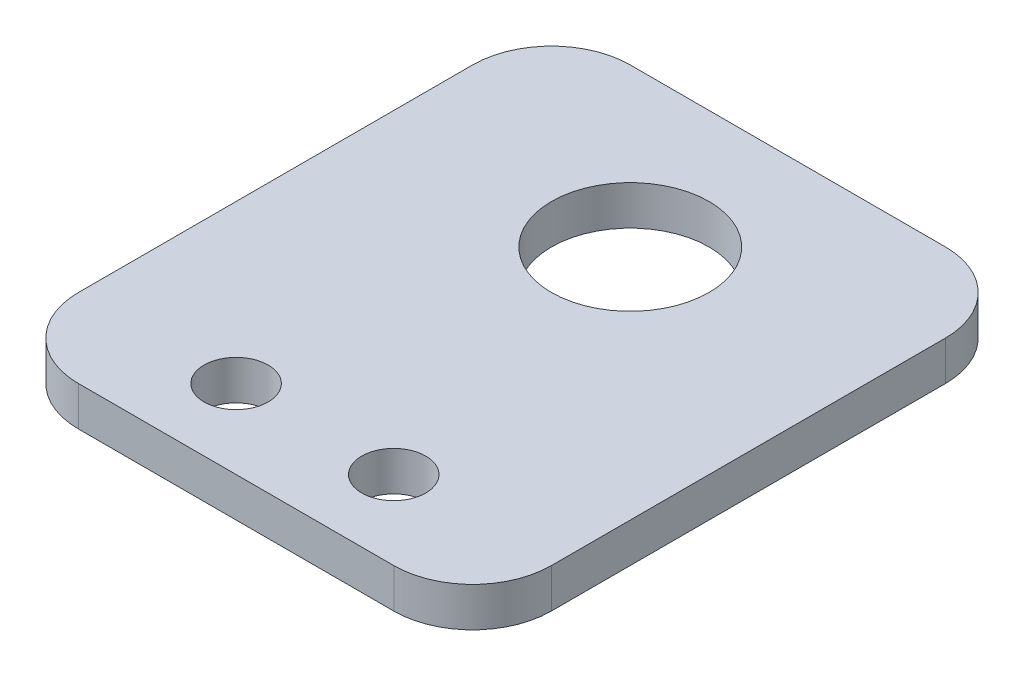
ISO-10303-21;
HEADER;
FILE_DESCRIPTION(('STEP AP214'),'2;1');
FILE_NAME('part.step','',(''),(''),'','','');
FILE_SCHEMA(('AUTOMOTIVE_DESIGN { 1 0 10303 214 1 1 1 1 }'));
ENDSEC;
DATA;
#1=APPLICATION_CONTEXT('core data for automotive mechanical design processes');
#2=APPLICATION_PROTOCOL_DEFINITION('international standard','automotive_design',2000,#1);
#3=PRODUCT_CONTEXT('',#1,'mechanical');
#4=PRODUCT('Part','Part','',(#3));
#5=PRODUCT_RELATED_PRODUCT_CATEGORY('part','',(#4));
#6=PRODUCT_DEFINITION_FORMATION('','',#4);
#7=PRODUCT_DEFINITION_CONTEXT('part definition',#1,'design');
#8=PRODUCT_DEFINITION('design','',#6,#7);
#9=PRODUCT_DEFINITION_SHAPE('','',#8);
#10=(LENGTH_UNIT() NAMED_UNIT(*) SI_UNIT(.MILLI.,.METRE.));
#11=(NAMED_UNIT(*) PLANE_ANGLE_UNIT() SI_UNIT($,.RADIAN.));
#12=(NAMED_UNIT(*) SI_UNIT($,.STERADIAN.) SOLID_ANGLE_UNIT());
#13=UNCERTAINTY_MEASURE_WITH_UNIT(LENGTH_MEASURE(1.E-05),#10,'distance_accuracy_value','');
#14=(GEOMETRIC_REPRESENTATION_CONTEXT(3) GLOBAL_UNCERTAINTY_ASSIGNED_CONTEXT((#13)) GLOBAL_UNIT_ASSIGNED_CONTEXT((#10,
#11,#12)) REPRESENTATION_CONTEXT('',''));
#15=CARTESIAN_POINT('',(0.,0.,0.));
#16=DIRECTION('',(0.,0.,1.));
#17=DIRECTION('',(1.,0.,0.));
#18=AXIS2_PLACEMENT_3D('',#15,#16,#17);
#19=CARTESIAN_POINT('',(25.4,6.35,31.75));
#20=DIRECTION('',(0.,-1.,0.));
#21=DIRECTION('',(0.,0.,-1.));
#22=AXIS2_PLACEMENT_3D('',#19,#20,#21);
#23=CYLINDRICAL_SURFACE('',#22,12.7);
#24=CARTESIAN_POINT('',(25.4,0.,31.75));
#25=DIRECTION('',(0.,1.,0.));
#26=DIRECTION('',(0.,0.,1.));
#27=AXIS2_PLACEMENT_3D('',#24,#25,#26);
#28=CIRCLE('',#27,12.7);
#29=CARTESIAN_POINT('',(25.3999999999999,0.,44.45));
#30=VERTEX_POINT('',#29);
#31=CARTESIAN_POINT('',(38.1,0.,31.7499999999999));
#32=VERTEX_POINT('',#31);
#33=EDGE_CURVE('E165',#30,#32,#28,.T.);
#34=ORIENTED_EDGE('',*,*,#33,.T.);
#35=DIRECTION('',(0.,-1.,0.));
#36=VECTOR('',#35,1.);
#37=CARTESIAN_POINT('',(38.1,6.35,31.7499999999999));
#38=LINE('',#37,#36);
#39=CARTESIAN_POINT('',(38.1,6.35,31.7499999999999));
#40=VERTEX_POINT('',#39);
#41=EDGE_CURVE('E11',#40,#32,#38,.T.);
#42=ORIENTED_EDGE('',*,*,#41,.F.);
#43=CARTESIAN_POINT('',(25.4,6.35,31.75));
#44=DIRECTION('',(0.,1.,0.));
#45=DIRECTION('',(0.,0.,1.));
#46=AXIS2_PLACEMENT_3D('',#43,#44,#45);
#47=CIRCLE('',#46,12.7);
#48=CARTESIAN_POINT('',(25.3999999999999,6.35,44.45));
#49=VERTEX_POINT('',#48);
#50=EDGE_CURVE('E188',#49,#40,#47,.T.);
#51=ORIENTED_EDGE('',*,*,#50,.F.);
#52=DIRECTION('',(0.,-1.,0.));
#53=VECTOR('',#52,1.);
#54=CARTESIAN_POINT('',(25.3999999999999,6.35,44.45));
#55=LINE('',#54,#53);
#56=EDGE_CURVE('E161',#49,#30,#55,.T.);
#57=ORIENTED_EDGE('',*,*,#56,.T.);
#58=EDGE_LOOP('',(#34,#42,#51,#57));
#59=FACE_BOUND('',#58,.T.);
#60=ADVANCED_FACE('F47',(#59),#23,.T.);
#61=CARTESIAN_POINT('',(38.1,6.35,-31.7499999999999));
#62=DIRECTION('',(-1.,0.,0.));
#63=DIRECTION('',(0.,0.,1.));
#64=AXIS2_PLACEMENT_3D('',#61,#62,#63);
#65=PLANE('',#64);
#66=DIRECTION('',(0.,0.,-1.));
#67=VECTOR('',#66,1.);
#68=CARTESIAN_POINT('',(38.1,0.,-31.7499999999999));
#69=LINE('',#68,#67);
#70=CARTESIAN_POINT('',(38.1,0.,-31.7499999999999));
#71=VERTEX_POINT('',#70);
#72=EDGE_CURVE('E169',#32,#71,#69,.T.);
#73=ORIENTED_EDGE('',*,*,#72,.T.);
#74=DIRECTION('',(0.,-1.,0.));
#75=VECTOR('',#74,1.);
#76=CARTESIAN_POINT('',(38.1,6.35,-31.7499999999999));
#77=LINE('',#76,#75);
#78=CARTESIAN_POINT('',(38.1,6.35,-31.7499999999999));
#79=VERTEX_POINT('',#78);
#80=EDGE_CURVE('E56',#79,#71,#77,.T.);
#81=ORIENTED_EDGE('',*,*,#80,.F.);
#82=DIRECTION('',(0.,0.,-1.));
#83=VECTOR('',#82,1.);
#84=CARTESIAN_POINT('',(38.1,6.35,-31.7499999999999));
#85=LINE('',#84,#83);
#86=EDGE_CURVE('E120',#40,#79,#85,.T.);
#87=ORIENTED_EDGE('',*,*,#86,.F.);
#88=ORIENTED_EDGE('',*,*,#41,.T.);
#89=EDGE_LOOP('',(#73,#81,#87,#88));
#90=FACE_BOUND('',#89,.T.);
#91=ADVANCED_FACE('F286',(#90),#65,.F.);
#92=CARTESIAN_POINT('',(25.4,6.35,-31.75));
#93=DIRECTION('',(0.,-1.,0.));
#94=DIRECTION('',(0.,0.,-1.));
#95=AXIS2_PLACEMENT_3D('',#92,#93,#94);
#96=CYLINDRICAL_SURFACE('',#95,12.7);
#97=CARTESIAN_POINT('',(25.4,0.,-31.75));
#98=DIRECTION('',(0.,1.,0.));
#99=DIRECTION('',(0.,0.,1.));
#100=AXIS2_PLACEMENT_3D('',#97,#98,#99);
#101=CIRCLE('',#100,12.7);
#102=CARTESIAN_POINT('',(25.3999999999999,0.,-44.45));
#103=VERTEX_POINT('',#102);
#104=EDGE_CURVE('E173',#71,#103,#101,.T.);
#105=ORIENTED_EDGE('',*,*,#104,.T.);
#106=DIRECTION('',(0.,-1.,0.));
#107=VECTOR('',#106,1.);
#108=CARTESIAN_POINT('',(25.3999999999999,6.35,-44.45));
#109=LINE('',#108,#107);
#110=CARTESIAN_POINT('',(25.3999999999999,6.35,-44.45));
#111=VERTEX_POINT('',#110);
#112=EDGE_CURVE('E199',#111,#103,#109,.T.);
#113=ORIENTED_EDGE('',*,*,#112,.F.);
#114=CARTESIAN_POINT('',(25.4,6.35,-31.75));
#115=DIRECTION('',(0.,1.,0.));
#116=DIRECTION('',(0.,0.,1.));
#117=AXIS2_PLACEMENT_3D('',#114,#115,#116);
#118=CIRCLE('',#117,12.7);
#119=EDGE_CURVE('E210',#79,#111,#118,.T.);
#120=ORIENTED_EDGE('',*,*,#119,.F.);
#121=ORIENTED_EDGE('',*,*,#80,.T.);
#122=EDGE_LOOP('',(#105,#113,#120,#121));
#123=FACE_BOUND('',#122,.T.);
#124=ADVANCED_FACE('F208',(#123),#96,.T.);
#125=CARTESIAN_POINT('',(-25.3999999999999,6.35,-44.45));
#126=DIRECTION('',(0.,0.,1.));
#127=DIRECTION('',(1.,0.,0.));
#128=AXIS2_PLACEMENT_3D('',#125,#126,#127);
#129=PLANE('',#128);
#130=DIRECTION('',(-1.,0.,0.));
#131=VECTOR('',#130,1.);
#132=CARTESIAN_POINT('',(-25.3999999999999,0.,-44.45));
#133=LINE('',#132,#131);
#134=CARTESIAN_POINT('',(-25.3999999999999,0.,-44.45));
#135=VERTEX_POINT('',#134);
#136=EDGE_CURVE('E176',#103,#135,#133,.T.);
#137=ORIENTED_EDGE('',*,*,#136,.T.);
#138=DIRECTION('',(0.,-1.,0.));
#139=VECTOR('',#138,1.);
#140=CARTESIAN_POINT('',(-25.3999999999999,6.35,-44.45));
#141=LINE('',#140,#139);
#142=CARTESIAN_POINT('',(-25.3999999999999,6.35,-44.45));
#143=VERTEX_POINT('',#142);
#144=EDGE_CURVE('E195',#143,#135,#141,.T.);
#145=ORIENTED_EDGE('',*,*,#144,.F.);
#146=DIRECTION('',(-1.,0.,0.));
#147=VECTOR('',#146,1.);
#148=CARTESIAN_POINT('',(-25.3999999999999,6.35,-44.45));
#149=LINE('',#148,#147);
#150=EDGE_CURVE('E222',#111,#143,#149,.T.);
#151=ORIENTED_EDGE('',*,*,#150,.F.);
#152=ORIENTED_EDGE('',*,*,#112,.T.);
#153=EDGE_LOOP('',(#137,#145,#151,#152));
#154=FACE_BOUND('',#153,.T.);
#155=ADVANCED_FACE('F218',(#154),#129,.F.);
#156=CARTESIAN_POINT('',(-25.4,6.35,-31.75));
#157=DIRECTION('',(0.,-1.,0.));
#158=DIRECTION('',(0.,0.,-1.));
#159=AXIS2_PLACEMENT_3D('',#156,#157,#158);
#160=CYLINDRICAL_SURFACE('',#159,12.7);
#161=CARTESIAN_POINT('',(-25.4,0.,-31.75));
#162=DIRECTION('',(0.,1.,0.));
#163=DIRECTION('',(0.,0.,1.));
#164=AXIS2_PLACEMENT_3D('',#161,#162,#163);
#165=CIRCLE('',#164,12.7);
#166=CARTESIAN_POINT('',(-38.1,0.,-31.7499999999999));
#167=VERTEX_POINT('',#166);
#168=EDGE_CURVE('E179',#135,#167,#165,.T.);
#169=ORIENTED_EDGE('',*,*,#168,.T.);
#170=DIRECTION('',(0.,-1.,0.));
#171=VECTOR('',#170,1.);
#172=CARTESIAN_POINT('',(-38.1,6.35,-31.7499999999999));
#173=LINE('',#172,#171);
#174=CARTESIAN_POINT('',(-38.1,6.35,-31.7499999999999));
#175=VERTEX_POINT('',#174);
#176=EDGE_CURVE('E153',#175,#167,#173,.T.);
#177=ORIENTED_EDGE('',*,*,#176,.F.);
#178=CARTESIAN_POINT('',(-25.4,6.35,-31.75));
#179=DIRECTION('',(0.,1.,0.));
#180=DIRECTION('',(0.,0.,1.));
#181=AXIS2_PLACEMENT_3D('',#178,#179,#180);
#182=CIRCLE('',#181,12.7);
#183=EDGE_CURVE('E142',#143,#175,#182,.T.);
#184=ORIENTED_EDGE('',*,*,#183,.F.);
#185=ORIENTED_EDGE('',*,*,#144,.T.);
#186=EDGE_LOOP('',(#169,#177,#184,#185));
#187=FACE_BOUND('',#186,.T.);
#188=ADVANCED_FACE('F221',(#187),#160,.T.);
#189=CARTESIAN_POINT('',(-38.1,6.35,-31.7499999999999));
#190=DIRECTION('',(1.,0.,0.));
#191=DIRECTION('',(0.,0.,-1.));
#192=AXIS2_PLACEMENT_3D('',#189,#190,#191);
#193=PLANE('',#192);
#194=DIRECTION('',(0.,0.,1.));
#195=VECTOR('',#194,1.);
#196=CARTESIAN_POINT('',(-38.1,0.,-31.7499999999999));
#197=LINE('',#196,#195);
#198=CARTESIAN_POINT('',(-38.1,0.,31.7499999999999));
#199=VERTEX_POINT('',#198);
#200=EDGE_CURVE('E151',#167,#199,#197,.T.);
#201=ORIENTED_EDGE('',*,*,#200,.T.);
#202=DIRECTION('',(0.,-1.,0.));
#203=VECTOR('',#202,1.);
#204=CARTESIAN_POINT('',(-38.1,6.35,31.7499999999999));
#205=LINE('',#204,#203);
#206=CARTESIAN_POINT('',(-38.1,6.35,31.7499999999999));
#207=VERTEX_POINT('',#206);
#208=EDGE_CURVE('E148',#207,#199,#205,.T.);
#209=ORIENTED_EDGE('',*,*,#208,.F.);
#210=DIRECTION('',(0.,0.,1.));
#211=VECTOR('',#210,1.);
#212=CARTESIAN_POINT('',(-38.1,6.35,-31.7499999999999));
#213=LINE('',#212,#211);
#214=EDGE_CURVE('E136',#175,#207,#213,.T.);
#215=ORIENTED_EDGE('',*,*,#214,.F.);
#216=ORIENTED_EDGE('',*,*,#176,.T.);
#217=EDGE_LOOP('',(#201,#209,#215,#216));
#218=FACE_BOUND('',#217,.T.);
#219=ADVANCED_FACE('F149',(#218),#193,.F.);
#220=CARTESIAN_POINT('',(-25.4,6.35,31.75));
#221=DIRECTION('',(0.,-1.,0.));
#222=DIRECTION('',(0.,0.,-1.));
#223=AXIS2_PLACEMENT_3D('',#220,#221,#222);
#224=CYLINDRICAL_SURFACE('',#223,12.7);
#225=CARTESIAN_POINT('',(-25.4,0.,31.75));
#226=DIRECTION('',(0.,1.,0.));
#227=DIRECTION('',(0.,0.,-1.));
#228=AXIS2_PLACEMENT_3D('',#225,#226,#227);
#229=CIRCLE('',#228,12.7);
#230=CARTESIAN_POINT('',(-25.3999999999999,0.,44.45));
#231=VERTEX_POINT('',#230);
#232=EDGE_CURVE('E103',#199,#231,#229,.T.);
#233=ORIENTED_EDGE('',*,*,#232,.T.);
#234=DIRECTION('',(0.,-1.,0.));
#235=VECTOR('',#234,1.);
#236=CARTESIAN_POINT('',(-25.3999999999999,6.35,44.45));
#237=LINE('',#236,#235);
#238=CARTESIAN_POINT('',(-25.3999999999999,6.35,44.45));
#239=VERTEX_POINT('',#238);
#240=EDGE_CURVE('E154',#239,#231,#237,.T.);
#241=ORIENTED_EDGE('',*,*,#240,.F.);
#242=CARTESIAN_POINT('',(-25.4,6.35,31.75));
#243=DIRECTION('',(0.,1.,0.));
#244=DIRECTION('',(0.,0.,-1.));
#245=AXIS2_PLACEMENT_3D('',#242,#243,#244);
#246=CIRCLE('',#245,12.7);
#247=EDGE_CURVE('E140',#207,#239,#246,.T.);
#248=ORIENTED_EDGE('',*,*,#247,.F.);
#249=ORIENTED_EDGE('',*,*,#208,.T.);
#250=EDGE_LOOP('',(#233,#241,#248,#249));
#251=FACE_BOUND('',#250,.T.);
#252=ADVANCED_FACE('F156',(#251),#224,.T.);
#253=CARTESIAN_POINT('',(-25.3999999999999,6.35,44.45));
#254=DIRECTION('',(0.,0.,-1.));
#255=DIRECTION('',(-1.,0.,0.));
#256=AXIS2_PLACEMENT_3D('',#253,#254,#255);
#257=PLANE('',#256);
#258=DIRECTION('',(1.,0.,0.));
#259=VECTOR('',#258,1.);
#260=CARTESIAN_POINT('',(-25.3999999999999,0.,44.45));
#261=LINE('',#260,#259);
#262=EDGE_CURVE('E109',#231,#30,#261,.T.);
#263=ORIENTED_EDGE('',*,*,#262,.T.);
#264=ORIENTED_EDGE('',*,*,#56,.F.);
#265=DIRECTION('',(1.,0.,0.));
#266=VECTOR('',#265,1.);
#267=CARTESIAN_POINT('',(-25.3999999999999,6.35,44.45));
#268=LINE('',#267,#266);
#269=EDGE_CURVE('E66',#239,#49,#268,.T.);
#270=ORIENTED_EDGE('',*,*,#269,.F.);
#271=ORIENTED_EDGE('',*,*,#240,.T.);
#272=EDGE_LOOP('',(#263,#264,#270,#271));
#273=FACE_BOUND('',#272,.T.);
#274=ADVANCED_FACE('F266',(#273),#257,.F.);
#275=CARTESIAN_POINT('',(25.4,6.35,31.75));
#276=DIRECTION('',(0.,1.,0.));
#277=DIRECTION('',(0.,0.,1.));
#278=AXIS2_PLACEMENT_3D('',#275,#276,#277);
#279=PLANE('',#278);
#280=CARTESIAN_POINT('',(0.,6.35,-19.05));
#281=DIRECTION('',(0.,1.,0.));
#282=DIRECTION('',(0.,0.,1.));
#283=AXIS2_PLACEMENT_3D('',#280,#281,#282);
#284=CIRCLE('',#283,12.7);
#285=CARTESIAN_POINT('',(0.,6.35,-6.34999999999999));
#286=VERTEX_POINT('',#285);
#287=EDGE_CURVE('E247',#286,#286,#284,.T.);
#288=ORIENTED_EDGE('',*,*,#287,.F.);
#289=EDGE_LOOP('',(#288));
#290=FACE_BOUND('',#289,.T.);
#291=CARTESIAN_POINT('',(-12.7,6.35,31.75));
#292=DIRECTION('',(0.,1.,0.));
#293=DIRECTION('',(0.,0.,1.));
#294=AXIS2_PLACEMENT_3D('',#291,#292,#293);
#295=CIRCLE('',#294,5.159375);
#296=CARTESIAN_POINT('',(-12.7,6.35,36.909375));
#297=VERTEX_POINT('',#296);
#298=EDGE_CURVE('E244',#297,#297,#295,.T.);
#299=ORIENTED_EDGE('',*,*,#298,.F.);
#300=EDGE_LOOP('',(#299));
#301=FACE_BOUND('',#300,.T.);
#302=CARTESIAN_POINT('',(12.7,6.35,31.75));
#303=DIRECTION('',(0.,1.,0.));
#304=DIRECTION('',(0.,0.,-1.));
#305=AXIS2_PLACEMENT_3D('',#302,#303,#304);
#306=CIRCLE('',#305,5.159375);
#307=CARTESIAN_POINT('',(12.7,6.35,26.590625));
#308=VERTEX_POINT('',#307);
#309=EDGE_CURVE('E236',#308,#308,#306,.T.);
#310=ORIENTED_EDGE('',*,*,#309,.F.);
#311=EDGE_LOOP('',(#310));
#312=FACE_BOUND('',#311,.T.);
#313=ORIENTED_EDGE('',*,*,#50,.T.);
#314=ORIENTED_EDGE('',*,*,#86,.T.);
#315=ORIENTED_EDGE('',*,*,#119,.T.);
#316=ORIENTED_EDGE('',*,*,#150,.T.);
#317=ORIENTED_EDGE('',*,*,#183,.T.);
#318=ORIENTED_EDGE('',*,*,#214,.T.);
#319=ORIENTED_EDGE('',*,*,#247,.T.);
#320=ORIENTED_EDGE('',*,*,#269,.T.);
#321=EDGE_LOOP('',(#313,#314,#315,#316,#317,#318,#319,#320));
#322=FACE_BOUND('',#321,.T.);
#323=ADVANCED_FACE('F138',(#290,#301,#312,#322),#279,.T.);
#324=CARTESIAN_POINT('',(25.4,0.,31.75));
#325=DIRECTION('',(0.,1.,0.));
#326=DIRECTION('',(0.,0.,1.));
#327=AXIS2_PLACEMENT_3D('',#324,#325,#326);
#328=PLANE('',#327);
#329=CARTESIAN_POINT('',(0.,0.,-19.05));
#330=DIRECTION('',(0.,1.,0.));
#331=DIRECTION('',(0.,0.,1.));
#332=AXIS2_PLACEMENT_3D('',#329,#330,#331);
#333=CIRCLE('',#332,12.7);
#334=CARTESIAN_POINT('',(0.,0.,-6.34999999999999));
#335=VERTEX_POINT('',#334);
#336=EDGE_CURVE('E170',#335,#335,#333,.T.);
#337=ORIENTED_EDGE('',*,*,#336,.T.);
#338=EDGE_LOOP('',(#337));
#339=FACE_BOUND('',#338,.T.);
#340=CARTESIAN_POINT('',(-12.7,0.,31.75));
#341=DIRECTION('',(0.,1.,0.));
#342=DIRECTION('',(0.,0.,1.));
#343=AXIS2_PLACEMENT_3D('',#340,#341,#342);
#344=CIRCLE('',#343,5.159375);
#345=CARTESIAN_POINT('',(-12.7,0.,36.909375));
#346=VERTEX_POINT('',#345);
#347=EDGE_CURVE('E240',#346,#346,#344,.T.);
#348=ORIENTED_EDGE('',*,*,#347,.T.);
#349=EDGE_LOOP('',(#348));
#350=FACE_BOUND('',#349,.T.);
#351=CARTESIAN_POINT('',(12.7,0.,31.75));
#352=DIRECTION('',(0.,1.,0.));
#353=DIRECTION('',(0.,0.,-1.));
#354=AXIS2_PLACEMENT_3D('',#351,#352,#353);
#355=CIRCLE('',#354,5.159375);
#356=CARTESIAN_POINT('',(12.7,0.,26.590625));
#357=VERTEX_POINT('',#356);
#358=EDGE_CURVE('E232',#357,#357,#355,.T.);
#359=ORIENTED_EDGE('',*,*,#358,.T.);
#360=EDGE_LOOP('',(#359));
#361=FACE_BOUND('',#360,.T.);
#362=ORIENTED_EDGE('',*,*,#33,.F.);
#363=ORIENTED_EDGE('',*,*,#262,.F.);
#364=ORIENTED_EDGE('',*,*,#232,.F.);
#365=ORIENTED_EDGE('',*,*,#200,.F.);
#366=ORIENTED_EDGE('',*,*,#168,.F.);
#367=ORIENTED_EDGE('',*,*,#136,.F.);
#368=ORIENTED_EDGE('',*,*,#104,.F.);
#369=ORIENTED_EDGE('',*,*,#72,.F.);
#370=EDGE_LOOP('',(#362,#363,#364,#365,#366,#367,#368,#369));
#371=FACE_BOUND('',#370,.T.);
#372=ADVANCED_FACE('F214',(#339,#350,#361,#371),#328,.F.);
#373=CARTESIAN_POINT('',(12.7,0.,31.75));
#374=DIRECTION('',(0.,1.,0.));
#375=DIRECTION('',(0.,0.,1.));
#376=AXIS2_PLACEMENT_3D('',#373,#374,#375);
#377=CYLINDRICAL_SURFACE('',#376,5.159375);
#378=ORIENTED_EDGE('',*,*,#358,.F.);
#379=EDGE_LOOP('',(#378));
#380=FACE_BOUND('',#379,.T.);
#381=ORIENTED_EDGE('',*,*,#309,.T.);
#382=EDGE_LOOP('',(#381));
#383=FACE_BOUND('',#382,.T.);
#384=ADVANCED_FACE('F272',(#380,#383),#377,.F.);
#385=CARTESIAN_POINT('',(-12.7,0.,31.75));
#386=DIRECTION('',(0.,1.,0.));
#387=DIRECTION('',(0.,0.,1.));
#388=AXIS2_PLACEMENT_3D('',#385,#386,#387);
#389=CYLINDRICAL_SURFACE('',#388,5.159375);
#390=ORIENTED_EDGE('',*,*,#347,.F.);
#391=EDGE_LOOP('',(#390));
#392=FACE_BOUND('',#391,.T.);
#393=ORIENTED_EDGE('',*,*,#298,.T.);
#394=EDGE_LOOP('',(#393));
#395=FACE_BOUND('',#394,.T.);
#396=ADVANCED_FACE('F260',(#392,#395),#389,.F.);
#397=CARTESIAN_POINT('',(0.,0.,-19.05));
#398=DIRECTION('',(0.,1.,0.));
#399=DIRECTION('',(0.,0.,1.));
#400=AXIS2_PLACEMENT_3D('',#397,#398,#399);
#401=CYLINDRICAL_SURFACE('',#400,12.7);
#402=ORIENTED_EDGE('',*,*,#336,.F.);
#403=EDGE_LOOP('',(#402));
#404=FACE_BOUND('',#403,.T.);
#405=ORIENTED_EDGE('',*,*,#287,.T.);
#406=EDGE_LOOP('',(#405));
#407=FACE_BOUND('',#406,.T.);
#408=ADVANCED_FACE('F257',(#404,#407),#401,.F.);
#409=CLOSED_SHELL('',(#60,#91,#124,#155,#188,#219,#252,#274,#323,#372,#384,#396,#408));
#410=MANIFOLD_SOLID_BREP('B2',#409);
#411=ADVANCED_BREP_SHAPE_REPRESENTATION('',(#18,#410),#14);
#412=SHAPE_DEFINITION_REPRESENTATION(#9,#411);
ENDSEC;
END-ISO-10303-21;
